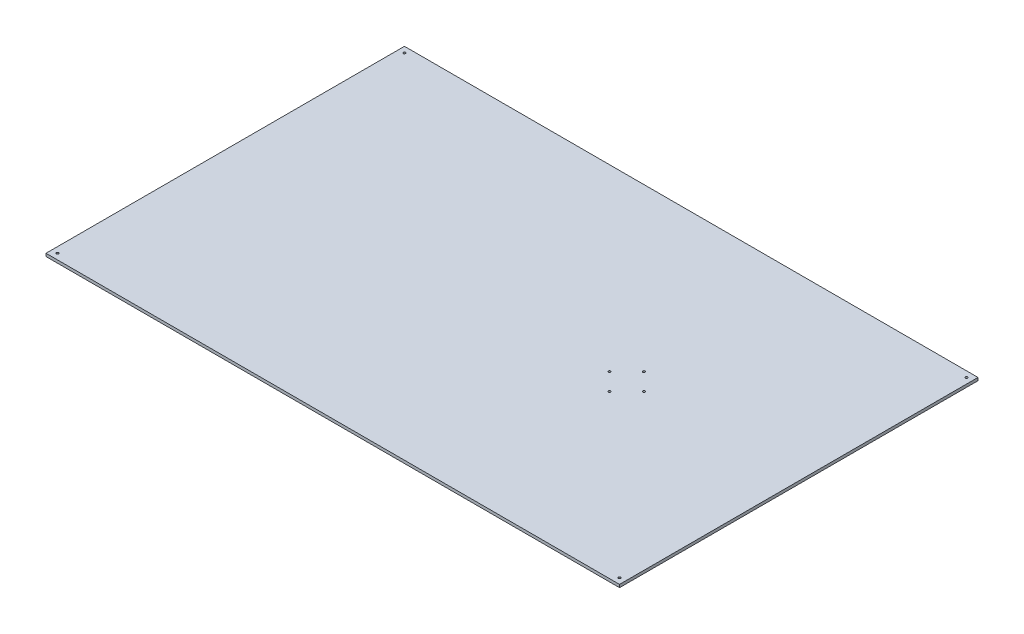
ISO-10303-21;
HEADER;
FILE_DESCRIPTION(('STEP AP214'),'2;1');
FILE_NAME('part.step','',(''),(''),'','','');
FILE_SCHEMA(('AUTOMOTIVE_DESIGN { 1 0 10303 214 1 1 1 1 }'));
ENDSEC;
DATA;
#1=APPLICATION_CONTEXT('core data for automotive mechanical design processes');
#2=APPLICATION_PROTOCOL_DEFINITION('international standard','automotive_design',2000,#1);
#3=PRODUCT_CONTEXT('',#1,'mechanical');
#4=PRODUCT('Part','Part','',(#3));
#5=PRODUCT_RELATED_PRODUCT_CATEGORY('part','',(#4));
#6=PRODUCT_DEFINITION_FORMATION('','',#4);
#7=PRODUCT_DEFINITION_CONTEXT('part definition',#1,'design');
#8=PRODUCT_DEFINITION('design','',#6,#7);
#9=PRODUCT_DEFINITION_SHAPE('','',#8);
#10=(LENGTH_UNIT() NAMED_UNIT(*) SI_UNIT(.MILLI.,.METRE.));
#11=(NAMED_UNIT(*) PLANE_ANGLE_UNIT() SI_UNIT($,.RADIAN.));
#12=(NAMED_UNIT(*) SI_UNIT($,.STERADIAN.) SOLID_ANGLE_UNIT());
#13=UNCERTAINTY_MEASURE_WITH_UNIT(LENGTH_MEASURE(1.E-05),#10,'distance_accuracy_value','');
#14=(GEOMETRIC_REPRESENTATION_CONTEXT(3) GLOBAL_UNCERTAINTY_ASSIGNED_CONTEXT((#13)) GLOBAL_UNIT_ASSIGNED_CONTEXT((#10,
#11,#12)) REPRESENTATION_CONTEXT('',''));
#15=CARTESIAN_POINT('',(0.,0.,0.));
#16=DIRECTION('',(0.,0.,1.));
#17=DIRECTION('',(1.,0.,0.));
#18=AXIS2_PLACEMENT_3D('',#15,#16,#17);
#19=CARTESIAN_POINT('',(-1000.,10.,-625.));
#20=DIRECTION('',(0.,0.,-1.));
#21=DIRECTION('',(-1.,0.,0.));
#22=AXIS2_PLACEMENT_3D('',#19,#20,#21);
#23=PLANE('',#22);
#24=DIRECTION('',(1.,0.,0.));
#25=VECTOR('',#24,1.);
#26=CARTESIAN_POINT('',(-1000.,0.,-625.));
#27=LINE('',#26,#25);
#28=CARTESIAN_POINT('',(-1000.,0.,-625.));
#29=VERTEX_POINT('',#28);
#30=CARTESIAN_POINT('',(1000.,0.,-625.));
#31=VERTEX_POINT('',#30);
#32=EDGE_CURVE('E103',#29,#31,#27,.T.);
#33=ORIENTED_EDGE('',*,*,#32,.F.);
#34=DIRECTION('',(0.,-1.,0.));
#35=VECTOR('',#34,1.);
#36=CARTESIAN_POINT('',(-1000.,10.,-625.));
#37=LINE('',#36,#35);
#38=CARTESIAN_POINT('',(-1000.,10.,-625.));
#39=VERTEX_POINT('',#38);
#40=EDGE_CURVE('E11',#39,#29,#37,.T.);
#41=ORIENTED_EDGE('',*,*,#40,.F.);
#42=DIRECTION('',(1.,0.,0.));
#43=VECTOR('',#42,1.);
#44=CARTESIAN_POINT('',(-1000.,10.,-625.));
#45=LINE('',#44,#43);
#46=CARTESIAN_POINT('',(1000.,10.,-625.));
#47=VERTEX_POINT('',#46);
#48=EDGE_CURVE('E97',#39,#47,#45,.T.);
#49=ORIENTED_EDGE('',*,*,#48,.T.);
#50=DIRECTION('',(0.,-1.,0.));
#51=VECTOR('',#50,1.);
#52=CARTESIAN_POINT('',(1000.,10.,-625.));
#53=LINE('',#52,#51);
#54=EDGE_CURVE('E76',#47,#31,#53,.T.);
#55=ORIENTED_EDGE('',*,*,#54,.T.);
#56=EDGE_LOOP('',(#33,#41,#49,#55));
#57=FACE_BOUND('',#56,.T.);
#58=ADVANCED_FACE('F35',(#57),#23,.T.);
#59=CARTESIAN_POINT('',(-1000.,10.,-625.));
#60=DIRECTION('',(1.,0.,0.));
#61=DIRECTION('',(0.,0.,-1.));
#62=AXIS2_PLACEMENT_3D('',#59,#60,#61);
#63=PLANE('',#62);
#64=DIRECTION('',(0.,0.,1.));
#65=VECTOR('',#64,1.);
#66=CARTESIAN_POINT('',(-1000.,0.,-625.));
#67=LINE('',#66,#65);
#68=CARTESIAN_POINT('',(-1000.,0.,625.));
#69=VERTEX_POINT('',#68);
#70=EDGE_CURVE('E68',#29,#69,#67,.T.);
#71=ORIENTED_EDGE('',*,*,#70,.T.);
#72=DIRECTION('',(0.,-1.,0.));
#73=VECTOR('',#72,1.);
#74=CARTESIAN_POINT('',(-1000.,10.,625.));
#75=LINE('',#74,#73);
#76=CARTESIAN_POINT('',(-1000.,10.,625.));
#77=VERTEX_POINT('',#76);
#78=EDGE_CURVE('E44',#77,#69,#75,.T.);
#79=ORIENTED_EDGE('',*,*,#78,.F.);
#80=DIRECTION('',(0.,0.,1.));
#81=VECTOR('',#80,1.);
#82=CARTESIAN_POINT('',(-1000.,10.,-625.));
#83=LINE('',#82,#81);
#84=EDGE_CURVE('E86',#39,#77,#83,.T.);
#85=ORIENTED_EDGE('',*,*,#84,.F.);
#86=ORIENTED_EDGE('',*,*,#40,.T.);
#87=EDGE_LOOP('',(#71,#79,#85,#86));
#88=FACE_BOUND('',#87,.T.);
#89=ADVANCED_FACE('F153',(#88),#63,.F.);
#90=CARTESIAN_POINT('',(-1000.,10.,625.));
#91=DIRECTION('',(0.,0.,-1.));
#92=DIRECTION('',(-1.,0.,0.));
#93=AXIS2_PLACEMENT_3D('',#90,#91,#92);
#94=PLANE('',#93);
#95=DIRECTION('',(1.,0.,0.));
#96=VECTOR('',#95,1.);
#97=CARTESIAN_POINT('',(-1000.,0.,625.));
#98=LINE('',#97,#96);
#99=CARTESIAN_POINT('',(1000.,0.,625.));
#100=VERTEX_POINT('',#99);
#101=EDGE_CURVE('E93',#69,#100,#98,.T.);
#102=ORIENTED_EDGE('',*,*,#101,.T.);
#103=DIRECTION('',(0.,-1.,0.));
#104=VECTOR('',#103,1.);
#105=CARTESIAN_POINT('',(1000.,10.,625.));
#106=LINE('',#105,#104);
#107=CARTESIAN_POINT('',(1000.,10.,625.));
#108=VERTEX_POINT('',#107);
#109=EDGE_CURVE('E90',#108,#100,#106,.T.);
#110=ORIENTED_EDGE('',*,*,#109,.F.);
#111=DIRECTION('',(1.,0.,0.));
#112=VECTOR('',#111,1.);
#113=CARTESIAN_POINT('',(-1000.,10.,625.));
#114=LINE('',#113,#112);
#115=EDGE_CURVE('E81',#77,#108,#114,.T.);
#116=ORIENTED_EDGE('',*,*,#115,.F.);
#117=ORIENTED_EDGE('',*,*,#78,.T.);
#118=EDGE_LOOP('',(#102,#110,#116,#117));
#119=FACE_BOUND('',#118,.T.);
#120=ADVANCED_FACE('F91',(#119),#94,.F.);
#121=CARTESIAN_POINT('',(1000.,10.,-625.));
#122=DIRECTION('',(1.,0.,0.));
#123=DIRECTION('',(0.,0.,-1.));
#124=AXIS2_PLACEMENT_3D('',#121,#122,#123);
#125=PLANE('',#124);
#126=DIRECTION('',(0.,0.,1.));
#127=VECTOR('',#126,1.);
#128=CARTESIAN_POINT('',(1000.,0.,-625.));
#129=LINE('',#128,#127);
#130=EDGE_CURVE('E106',#31,#100,#129,.T.);
#131=ORIENTED_EDGE('',*,*,#130,.F.);
#132=ORIENTED_EDGE('',*,*,#54,.F.);
#133=DIRECTION('',(0.,0.,1.));
#134=VECTOR('',#133,1.);
#135=CARTESIAN_POINT('',(1000.,10.,-625.));
#136=LINE('',#135,#134);
#137=EDGE_CURVE('E85',#47,#108,#136,.T.);
#138=ORIENTED_EDGE('',*,*,#137,.T.);
#139=ORIENTED_EDGE('',*,*,#109,.T.);
#140=EDGE_LOOP('',(#131,#132,#138,#139));
#141=FACE_BOUND('',#140,.T.);
#142=ADVANCED_FACE('F96',(#141),#125,.T.);
#143=CARTESIAN_POINT('',(0.,10.,0.));
#144=DIRECTION('',(0.,-1.,0.));
#145=DIRECTION('',(0.,0.,-1.));
#146=AXIS2_PLACEMENT_3D('',#143,#144,#145);
#147=PLANE('',#146);
#148=CARTESIAN_POINT('',(400.,10.,-60.));
#149=DIRECTION('',(0.,1.,0.));
#150=DIRECTION('',(0.,0.,1.));
#151=AXIS2_PLACEMENT_3D('',#148,#149,#150);
#152=CIRCLE('',#151,4.);
#153=CARTESIAN_POINT('',(400.,10.,-56.));
#154=VERTEX_POINT('',#153);
#155=EDGE_CURVE('E208',#154,#154,#152,.T.);
#156=ORIENTED_EDGE('',*,*,#155,.F.);
#157=EDGE_LOOP('',(#156));
#158=FACE_BOUND('',#157,.T.);
#159=CARTESIAN_POINT('',(340.,10.,0.));
#160=DIRECTION('',(0.,1.,0.));
#161=DIRECTION('',(0.,0.,1.));
#162=AXIS2_PLACEMENT_3D('',#159,#160,#161);
#163=CIRCLE('',#162,4.);
#164=CARTESIAN_POINT('',(340.,10.,4.));
#165=VERTEX_POINT('',#164);
#166=EDGE_CURVE('E210',#165,#165,#163,.T.);
#167=ORIENTED_EDGE('',*,*,#166,.F.);
#168=EDGE_LOOP('',(#167));
#169=FACE_BOUND('',#168,.T.);
#170=CARTESIAN_POINT('',(400.,10.,60.));
#171=DIRECTION('',(0.,1.,0.));
#172=DIRECTION('',(0.,0.,1.));
#173=AXIS2_PLACEMENT_3D('',#170,#171,#172);
#174=CIRCLE('',#173,4.);
#175=CARTESIAN_POINT('',(400.,10.,64.));
#176=VERTEX_POINT('',#175);
#177=EDGE_CURVE('E215',#176,#176,#174,.T.);
#178=ORIENTED_EDGE('',*,*,#177,.F.);
#179=EDGE_LOOP('',(#178));
#180=FACE_BOUND('',#179,.T.);
#181=CARTESIAN_POINT('',(460.,10.,0.));
#182=DIRECTION('',(0.,1.,0.));
#183=DIRECTION('',(0.,0.,1.));
#184=AXIS2_PLACEMENT_3D('',#181,#182,#183);
#185=CIRCLE('',#184,4.);
#186=CARTESIAN_POINT('',(460.,10.,4.));
#187=VERTEX_POINT('',#186);
#188=EDGE_CURVE('E130',#187,#187,#185,.T.);
#189=ORIENTED_EDGE('',*,*,#188,.F.);
#190=EDGE_LOOP('',(#189));
#191=FACE_BOUND('',#190,.T.);
#192=CARTESIAN_POINT('',(-980.,10.,-605.));
#193=DIRECTION('',(0.,1.,0.));
#194=DIRECTION('',(0.,0.,1.));
#195=AXIS2_PLACEMENT_3D('',#192,#193,#194);
#196=CIRCLE('',#195,4.);
#197=CARTESIAN_POINT('',(-980.,10.,-601.));
#198=VERTEX_POINT('',#197);
#199=EDGE_CURVE('E119',#198,#198,#196,.T.);
#200=ORIENTED_EDGE('',*,*,#199,.F.);
#201=EDGE_LOOP('',(#200));
#202=FACE_BOUND('',#201,.T.);
#203=CARTESIAN_POINT('',(980.,10.,-605.));
#204=DIRECTION('',(0.,1.,0.));
#205=DIRECTION('',(0.,0.,1.));
#206=AXIS2_PLACEMENT_3D('',#203,#204,#205);
#207=CIRCLE('',#206,4.);
#208=CARTESIAN_POINT('',(980.,10.,-601.));
#209=VERTEX_POINT('',#208);
#210=EDGE_CURVE('E116',#209,#209,#207,.T.);
#211=ORIENTED_EDGE('',*,*,#210,.F.);
#212=EDGE_LOOP('',(#211));
#213=FACE_BOUND('',#212,.T.);
#214=CARTESIAN_POINT('',(980.,10.,605.));
#215=DIRECTION('',(0.,1.,0.));
#216=DIRECTION('',(0.,0.,1.));
#217=AXIS2_PLACEMENT_3D('',#214,#215,#216);
#218=CIRCLE('',#217,4.);
#219=CARTESIAN_POINT('',(980.,10.,609.));
#220=VERTEX_POINT('',#219);
#221=EDGE_CURVE('E115',#220,#220,#218,.T.);
#222=ORIENTED_EDGE('',*,*,#221,.F.);
#223=EDGE_LOOP('',(#222));
#224=FACE_BOUND('',#223,.T.);
#225=CARTESIAN_POINT('',(-980.,10.,605.));
#226=DIRECTION('',(0.,1.,0.));
#227=DIRECTION('',(0.,0.,1.));
#228=AXIS2_PLACEMENT_3D('',#225,#226,#227);
#229=CIRCLE('',#228,4.);
#230=CARTESIAN_POINT('',(-980.,10.,609.));
#231=VERTEX_POINT('',#230);
#232=EDGE_CURVE('E139',#231,#231,#229,.T.);
#233=ORIENTED_EDGE('',*,*,#232,.F.);
#234=EDGE_LOOP('',(#233));
#235=FACE_BOUND('',#234,.T.);
#236=ORIENTED_EDGE('',*,*,#48,.F.);
#237=ORIENTED_EDGE('',*,*,#84,.T.);
#238=ORIENTED_EDGE('',*,*,#115,.T.);
#239=ORIENTED_EDGE('',*,*,#137,.F.);
#240=EDGE_LOOP('',(#236,#237,#238,#239));
#241=FACE_BOUND('',#240,.T.);
#242=ADVANCED_FACE('F84',(#158,#169,#180,#191,#202,#213,#224,#235,#241),#147,.F.);
#243=CARTESIAN_POINT('',(0.,0.,0.));
#244=DIRECTION('',(0.,-1.,0.));
#245=DIRECTION('',(0.,0.,-1.));
#246=AXIS2_PLACEMENT_3D('',#243,#244,#245);
#247=PLANE('',#246);
#248=CARTESIAN_POINT('',(400.,0.,-60.));
#249=DIRECTION('',(0.,-1.,0.));
#250=DIRECTION('',(0.,0.,-1.));
#251=AXIS2_PLACEMENT_3D('',#248,#249,#250);
#252=CIRCLE('',#251,4.);
#253=CARTESIAN_POINT('',(400.,0.,-64.));
#254=VERTEX_POINT('',#253);
#255=EDGE_CURVE('E206',#254,#254,#252,.T.);
#256=ORIENTED_EDGE('',*,*,#255,.F.);
#257=EDGE_LOOP('',(#256));
#258=FACE_BOUND('',#257,.T.);
#259=CARTESIAN_POINT('',(340.,0.,0.));
#260=DIRECTION('',(0.,-1.,0.));
#261=DIRECTION('',(0.,0.,-1.));
#262=AXIS2_PLACEMENT_3D('',#259,#260,#261);
#263=CIRCLE('',#262,4.);
#264=CARTESIAN_POINT('',(340.,0.,-4.));
#265=VERTEX_POINT('',#264);
#266=EDGE_CURVE('E38',#265,#265,#263,.T.);
#267=ORIENTED_EDGE('',*,*,#266,.F.);
#268=EDGE_LOOP('',(#267));
#269=FACE_BOUND('',#268,.T.);
#270=CARTESIAN_POINT('',(400.,0.,60.));
#271=DIRECTION('',(0.,-1.,0.));
#272=DIRECTION('',(0.,0.,-1.));
#273=AXIS2_PLACEMENT_3D('',#270,#271,#272);
#274=CIRCLE('',#273,4.);
#275=CARTESIAN_POINT('',(400.,0.,56.));
#276=VERTEX_POINT('',#275);
#277=EDGE_CURVE('E218',#276,#276,#274,.T.);
#278=ORIENTED_EDGE('',*,*,#277,.F.);
#279=EDGE_LOOP('',(#278));
#280=FACE_BOUND('',#279,.T.);
#281=CARTESIAN_POINT('',(460.,0.,0.));
#282=DIRECTION('',(0.,-1.,0.));
#283=DIRECTION('',(0.,0.,-1.));
#284=AXIS2_PLACEMENT_3D('',#281,#282,#283);
#285=CIRCLE('',#284,4.);
#286=CARTESIAN_POINT('',(460.,0.,-4.));
#287=VERTEX_POINT('',#286);
#288=EDGE_CURVE('E125',#287,#287,#285,.T.);
#289=ORIENTED_EDGE('',*,*,#288,.F.);
#290=EDGE_LOOP('',(#289));
#291=FACE_BOUND('',#290,.T.);
#292=CARTESIAN_POINT('',(-980.,0.,-605.));
#293=DIRECTION('',(0.,-1.,0.));
#294=DIRECTION('',(0.,0.,-1.));
#295=AXIS2_PLACEMENT_3D('',#292,#293,#294);
#296=CIRCLE('',#295,4.);
#297=CARTESIAN_POINT('',(-980.,0.,-609.));
#298=VERTEX_POINT('',#297);
#299=EDGE_CURVE('E117',#298,#298,#296,.T.);
#300=ORIENTED_EDGE('',*,*,#299,.F.);
#301=EDGE_LOOP('',(#300));
#302=FACE_BOUND('',#301,.T.);
#303=CARTESIAN_POINT('',(980.,0.,-605.));
#304=DIRECTION('',(0.,-1.,0.));
#305=DIRECTION('',(0.,0.,-1.));
#306=AXIS2_PLACEMENT_3D('',#303,#304,#305);
#307=CIRCLE('',#306,4.);
#308=CARTESIAN_POINT('',(980.,0.,-609.));
#309=VERTEX_POINT('',#308);
#310=EDGE_CURVE('E113',#309,#309,#307,.T.);
#311=ORIENTED_EDGE('',*,*,#310,.F.);
#312=EDGE_LOOP('',(#311));
#313=FACE_BOUND('',#312,.T.);
#314=CARTESIAN_POINT('',(980.,0.,605.));
#315=DIRECTION('',(0.,-1.,0.));
#316=DIRECTION('',(0.,0.,-1.));
#317=AXIS2_PLACEMENT_3D('',#314,#315,#316);
#318=CIRCLE('',#317,4.);
#319=CARTESIAN_POINT('',(980.,0.,601.));
#320=VERTEX_POINT('',#319);
#321=EDGE_CURVE('E136',#320,#320,#318,.T.);
#322=ORIENTED_EDGE('',*,*,#321,.F.);
#323=EDGE_LOOP('',(#322));
#324=FACE_BOUND('',#323,.T.);
#325=CARTESIAN_POINT('',(-980.,0.,605.));
#326=DIRECTION('',(0.,-1.,0.));
#327=DIRECTION('',(0.,0.,-1.));
#328=AXIS2_PLACEMENT_3D('',#325,#326,#327);
#329=CIRCLE('',#328,4.);
#330=CARTESIAN_POINT('',(-980.,0.,601.));
#331=VERTEX_POINT('',#330);
#332=EDGE_CURVE('E107',#331,#331,#329,.T.);
#333=ORIENTED_EDGE('',*,*,#332,.F.);
#334=EDGE_LOOP('',(#333));
#335=FACE_BOUND('',#334,.T.);
#336=ORIENTED_EDGE('',*,*,#32,.T.);
#337=ORIENTED_EDGE('',*,*,#130,.T.);
#338=ORIENTED_EDGE('',*,*,#101,.F.);
#339=ORIENTED_EDGE('',*,*,#70,.F.);
#340=EDGE_LOOP('',(#336,#337,#338,#339));
#341=FACE_BOUND('',#340,.T.);
#342=ADVANCED_FACE('F147',(#258,#269,#280,#291,#302,#313,#324,#335,#341),#247,.T.);
#343=CARTESIAN_POINT('',(-980.,10.,605.));
#344=DIRECTION('',(0.,1.,0.));
#345=DIRECTION('',(0.,0.,1.));
#346=AXIS2_PLACEMENT_3D('',#343,#344,#345);
#347=CYLINDRICAL_SURFACE('',#346,4.);
#348=ORIENTED_EDGE('',*,*,#332,.T.);
#349=EDGE_LOOP('',(#348));
#350=FACE_BOUND('',#349,.T.);
#351=ORIENTED_EDGE('',*,*,#232,.T.);
#352=EDGE_LOOP('',(#351));
#353=FACE_BOUND('',#352,.T.);
#354=ADVANCED_FACE('F144',(#350,#353),#347,.F.);
#355=CARTESIAN_POINT('',(980.,10.,605.));
#356=DIRECTION('',(0.,1.,0.));
#357=DIRECTION('',(0.,0.,1.));
#358=AXIS2_PLACEMENT_3D('',#355,#356,#357);
#359=CYLINDRICAL_SURFACE('',#358,4.);
#360=ORIENTED_EDGE('',*,*,#321,.T.);
#361=EDGE_LOOP('',(#360));
#362=FACE_BOUND('',#361,.T.);
#363=ORIENTED_EDGE('',*,*,#221,.T.);
#364=EDGE_LOOP('',(#363));
#365=FACE_BOUND('',#364,.T.);
#366=ADVANCED_FACE('F175',(#362,#365),#359,.F.);
#367=CARTESIAN_POINT('',(980.,10.,-605.));
#368=DIRECTION('',(0.,1.,0.));
#369=DIRECTION('',(0.,0.,1.));
#370=AXIS2_PLACEMENT_3D('',#367,#368,#369);
#371=CYLINDRICAL_SURFACE('',#370,4.);
#372=ORIENTED_EDGE('',*,*,#310,.T.);
#373=EDGE_LOOP('',(#372));
#374=FACE_BOUND('',#373,.T.);
#375=ORIENTED_EDGE('',*,*,#210,.T.);
#376=EDGE_LOOP('',(#375));
#377=FACE_BOUND('',#376,.T.);
#378=ADVANCED_FACE('F178',(#374,#377),#371,.F.);
#379=CARTESIAN_POINT('',(-980.,10.,-605.));
#380=DIRECTION('',(0.,1.,0.));
#381=DIRECTION('',(0.,0.,1.));
#382=AXIS2_PLACEMENT_3D('',#379,#380,#381);
#383=CYLINDRICAL_SURFACE('',#382,4.);
#384=ORIENTED_EDGE('',*,*,#299,.T.);
#385=EDGE_LOOP('',(#384));
#386=FACE_BOUND('',#385,.T.);
#387=ORIENTED_EDGE('',*,*,#199,.T.);
#388=EDGE_LOOP('',(#387));
#389=FACE_BOUND('',#388,.T.);
#390=ADVANCED_FACE('F182',(#386,#389),#383,.F.);
#391=CARTESIAN_POINT('',(460.,10.,0.));
#392=DIRECTION('',(0.,1.,0.));
#393=DIRECTION('',(0.,0.,1.));
#394=AXIS2_PLACEMENT_3D('',#391,#392,#393);
#395=CYLINDRICAL_SURFACE('',#394,4.);
#396=ORIENTED_EDGE('',*,*,#288,.T.);
#397=EDGE_LOOP('',(#396));
#398=FACE_BOUND('',#397,.T.);
#399=ORIENTED_EDGE('',*,*,#188,.T.);
#400=EDGE_LOOP('',(#399));
#401=FACE_BOUND('',#400,.T.);
#402=ADVANCED_FACE('F186',(#398,#401),#395,.F.);
#403=CARTESIAN_POINT('',(400.,10.,60.));
#404=DIRECTION('',(0.,1.,0.));
#405=DIRECTION('',(0.,0.,1.));
#406=AXIS2_PLACEMENT_3D('',#403,#404,#405);
#407=CYLINDRICAL_SURFACE('',#406,4.);
#408=ORIENTED_EDGE('',*,*,#277,.T.);
#409=EDGE_LOOP('',(#408));
#410=FACE_BOUND('',#409,.T.);
#411=ORIENTED_EDGE('',*,*,#177,.T.);
#412=EDGE_LOOP('',(#411));
#413=FACE_BOUND('',#412,.T.);
#414=ADVANCED_FACE('F189',(#410,#413),#407,.F.);
#415=CARTESIAN_POINT('',(340.,10.,0.));
#416=DIRECTION('',(0.,1.,0.));
#417=DIRECTION('',(0.,0.,1.));
#418=AXIS2_PLACEMENT_3D('',#415,#416,#417);
#419=CYLINDRICAL_SURFACE('',#418,4.);
#420=ORIENTED_EDGE('',*,*,#266,.T.);
#421=EDGE_LOOP('',(#420));
#422=FACE_BOUND('',#421,.T.);
#423=ORIENTED_EDGE('',*,*,#166,.T.);
#424=EDGE_LOOP('',(#423));
#425=FACE_BOUND('',#424,.T.);
#426=ADVANCED_FACE('F193',(#422,#425),#419,.F.);
#427=CARTESIAN_POINT('',(400.,10.,-60.));
#428=DIRECTION('',(0.,1.,0.));
#429=DIRECTION('',(0.,0.,1.));
#430=AXIS2_PLACEMENT_3D('',#427,#428,#429);
#431=CYLINDRICAL_SURFACE('',#430,4.);
#432=ORIENTED_EDGE('',*,*,#255,.T.);
#433=EDGE_LOOP('',(#432));
#434=FACE_BOUND('',#433,.T.);
#435=ORIENTED_EDGE('',*,*,#155,.T.);
#436=EDGE_LOOP('',(#435));
#437=FACE_BOUND('',#436,.T.);
#438=ADVANCED_FACE('F197',(#434,#437),#431,.F.);
#439=CLOSED_SHELL('',(#58,#89,#120,#142,#242,#342,#354,#366,#378,#390,#402,#414,#426,#438));
#440=MANIFOLD_SOLID_BREP('B2',#439);
#441=ADVANCED_BREP_SHAPE_REPRESENTATION('',(#18,#440),#14);
#442=SHAPE_DEFINITION_REPRESENTATION(#9,#441);
ENDSEC;
END-ISO-10303-21;
